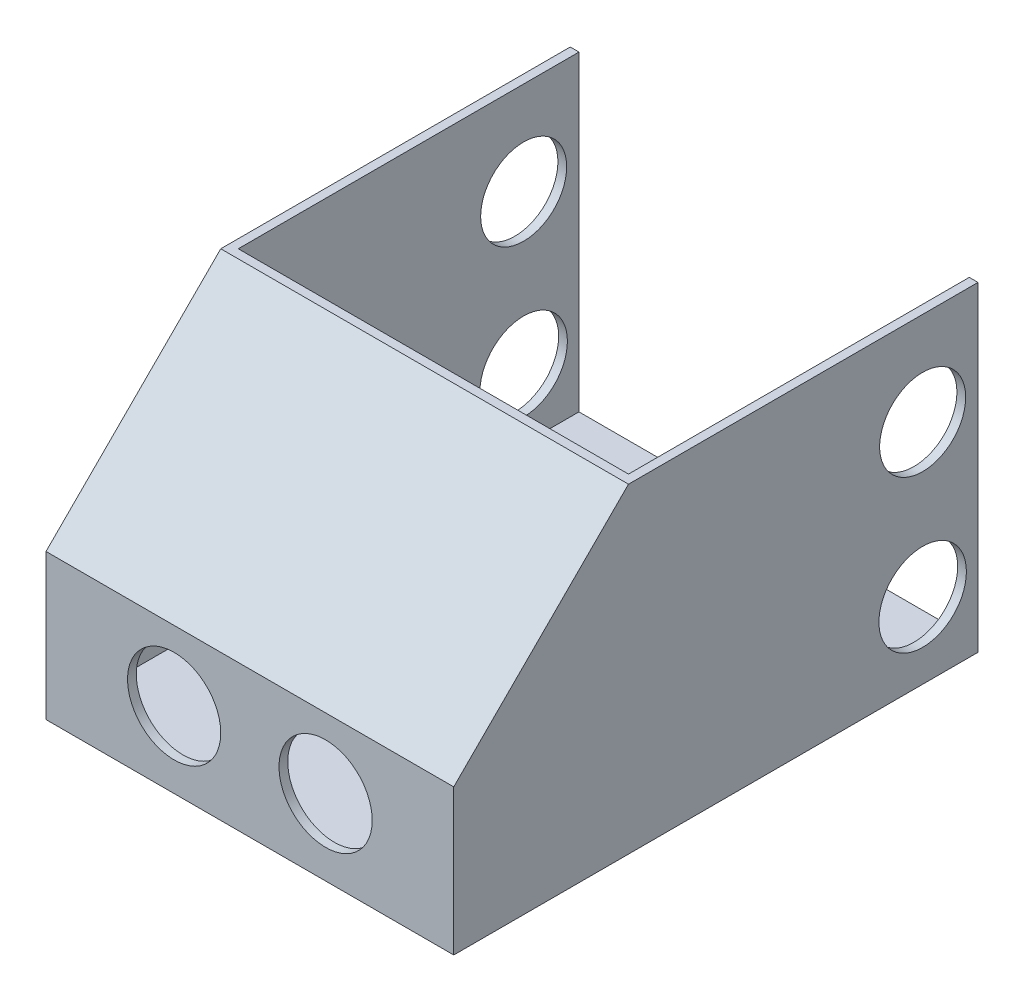
ISO-10303-21;
HEADER;
FILE_DESCRIPTION(('STEP AP214'),'2;1');
FILE_NAME('part.step','',(''),(''),'','','');
FILE_SCHEMA(('AUTOMOTIVE_DESIGN { 1 0 10303 214 1 1 1 1 }'));
ENDSEC;
DATA;
#1=APPLICATION_CONTEXT('core data for automotive mechanical design processes');
#2=APPLICATION_PROTOCOL_DEFINITION('international standard','automotive_design',2000,#1);
#3=PRODUCT_CONTEXT('',#1,'mechanical');
#4=PRODUCT('Part','Part','',(#3));
#5=PRODUCT_RELATED_PRODUCT_CATEGORY('part','',(#4));
#6=PRODUCT_DEFINITION_FORMATION('','',#4);
#7=PRODUCT_DEFINITION_CONTEXT('part definition',#1,'design');
#8=PRODUCT_DEFINITION('design','',#6,#7);
#9=PRODUCT_DEFINITION_SHAPE('','',#8);
#10=(LENGTH_UNIT() NAMED_UNIT(*) SI_UNIT(.MILLI.,.METRE.));
#11=(NAMED_UNIT(*) PLANE_ANGLE_UNIT() SI_UNIT($,.RADIAN.));
#12=(NAMED_UNIT(*) SI_UNIT($,.STERADIAN.) SOLID_ANGLE_UNIT());
#13=UNCERTAINTY_MEASURE_WITH_UNIT(LENGTH_MEASURE(1.E-05),#10,'distance_accuracy_value','');
#14=(GEOMETRIC_REPRESENTATION_CONTEXT(3) GLOBAL_UNCERTAINTY_ASSIGNED_CONTEXT((#13)) GLOBAL_UNIT_ASSIGNED_CONTEXT((#10,
#11,#12)) REPRESENTATION_CONTEXT('',''));
#15=CARTESIAN_POINT('',(0.,0.,0.));
#16=DIRECTION('',(0.,0.,1.));
#17=DIRECTION('',(1.,0.,0.));
#18=AXIS2_PLACEMENT_3D('',#15,#16,#17);
#19=CARTESIAN_POINT('',(35.,55.,-45.));
#20=DIRECTION('',(-1.,0.,0.));
#21=DIRECTION('',(0.,0.,1.));
#22=AXIS2_PLACEMENT_3D('',#19,#20,#21);
#23=PLANE('',#22);
#24=CARTESIAN_POINT('',(35.,39.,-35.5));
#25=DIRECTION('',(1.,0.,0.));
#26=DIRECTION('',(0.,0.,-1.));
#27=AXIS2_PLACEMENT_3D('',#24,#25,#26);
#28=CIRCLE('',#27,7.38265418762645);
#29=CARTESIAN_POINT('',(35.,39.,-42.8826541876264));
#30=VERTEX_POINT('',#29);
#31=EDGE_CURVE('E296',#30,#30,#28,.T.);
#32=ORIENTED_EDGE('',*,*,#31,.F.);
#33=EDGE_LOOP('',(#32));
#34=FACE_BOUND('',#33,.T.);
#35=CARTESIAN_POINT('',(35.,13.,-35.5));
#36=DIRECTION('',(1.,0.,0.));
#37=DIRECTION('',(0.,0.,-1.));
#38=AXIS2_PLACEMENT_3D('',#35,#36,#37);
#39=CIRCLE('',#38,7.509542531742);
#40=CARTESIAN_POINT('',(35.,13.,-43.009542531742));
#41=VERTEX_POINT('',#40);
#42=EDGE_CURVE('E203',#41,#41,#39,.T.);
#43=ORIENTED_EDGE('',*,*,#42,.F.);
#44=EDGE_LOOP('',(#43));
#45=FACE_BOUND('',#44,.T.);
#46=DIRECTION('',(0.,0.,-1.));
#47=VECTOR('',#46,1.);
#48=CARTESIAN_POINT('',(35.,55.,-45.));
#49=LINE('',#48,#47);
#50=CARTESIAN_POINT('',(35.,55.,15.));
#51=VERTEX_POINT('',#50);
#52=CARTESIAN_POINT('',(35.,55.,-45.));
#53=VERTEX_POINT('',#52);
#54=EDGE_CURVE('E151',#51,#53,#49,.T.);
#55=ORIENTED_EDGE('',*,*,#54,.F.);
#56=DIRECTION('',(0.,-0.707106781186549,0.707106781186546));
#57=VECTOR('',#56,1.);
#58=CARTESIAN_POINT('',(35.,55.,15.));
#59=LINE('',#58,#57);
#60=CARTESIAN_POINT('',(35.,24.9999999999999,45.));
#61=VERTEX_POINT('',#60);
#62=EDGE_CURVE('E183',#51,#61,#59,.T.);
#63=ORIENTED_EDGE('',*,*,#62,.T.);
#64=DIRECTION('',(0.,-1.,0.));
#65=VECTOR('',#64,1.);
#66=CARTESIAN_POINT('',(35.,55.,45.));
#67=LINE('',#66,#65);
#68=CARTESIAN_POINT('',(35.,0.,45.));
#69=VERTEX_POINT('',#68);
#70=EDGE_CURVE('E161',#61,#69,#67,.T.);
#71=ORIENTED_EDGE('',*,*,#70,.T.);
#72=DIRECTION('',(0.,0.,-1.));
#73=VECTOR('',#72,1.);
#74=CARTESIAN_POINT('',(35.,0.,-45.));
#75=LINE('',#74,#73);
#76=CARTESIAN_POINT('',(35.,0.,-45.));
#77=VERTEX_POINT('',#76);
#78=EDGE_CURVE('E146',#69,#77,#75,.T.);
#79=ORIENTED_EDGE('',*,*,#78,.T.);
#80=DIRECTION('',(0.,-1.,0.));
#81=VECTOR('',#80,1.);
#82=CARTESIAN_POINT('',(35.,55.,-45.));
#83=LINE('',#82,#81);
#84=EDGE_CURVE('E177',#53,#77,#83,.T.);
#85=ORIENTED_EDGE('',*,*,#84,.F.);
#86=EDGE_LOOP('',(#55,#63,#71,#79,#85));
#87=FACE_BOUND('',#86,.T.);
#88=ADVANCED_FACE('F33',(#34,#45,#87),#23,.F.);
#89=CARTESIAN_POINT('',(-35.,55.,-45.));
#90=DIRECTION('',(0.,0.,1.));
#91=DIRECTION('',(1.,0.,0.));
#92=AXIS2_PLACEMENT_3D('',#89,#90,#91);
#93=PLANE('',#92);
#94=DIRECTION('',(-1.,0.,0.));
#95=VECTOR('',#94,1.);
#96=CARTESIAN_POINT('',(33.5,1.5,-45.));
#97=LINE('',#96,#95);
#98=CARTESIAN_POINT('',(33.5,1.5,-45.));
#99=VERTEX_POINT('',#98);
#100=CARTESIAN_POINT('',(-33.5,1.5,-45.));
#101=VERTEX_POINT('',#100);
#102=EDGE_CURVE('E141',#99,#101,#97,.T.);
#103=ORIENTED_EDGE('',*,*,#102,.F.);
#104=DIRECTION('',(0.,-1.,0.));
#105=VECTOR('',#104,1.);
#106=CARTESIAN_POINT('',(33.5,55.,-45.));
#107=LINE('',#106,#105);
#108=CARTESIAN_POINT('',(33.5,55.,-45.));
#109=VERTEX_POINT('',#108);
#110=EDGE_CURVE('E114',#109,#99,#107,.T.);
#111=ORIENTED_EDGE('',*,*,#110,.F.);
#112=DIRECTION('',(-1.,0.,0.));
#113=VECTOR('',#112,1.);
#114=CARTESIAN_POINT('',(-35.,55.,-45.));
#115=LINE('',#114,#113);
#116=EDGE_CURVE('E155',#53,#109,#115,.T.);
#117=ORIENTED_EDGE('',*,*,#116,.F.);
#118=ORIENTED_EDGE('',*,*,#84,.T.);
#119=DIRECTION('',(-1.,0.,0.));
#120=VECTOR('',#119,1.);
#121=CARTESIAN_POINT('',(-35.,0.,-45.));
#122=LINE('',#121,#120);
#123=CARTESIAN_POINT('',(-35.,0.,-45.));
#124=VERTEX_POINT('',#123);
#125=EDGE_CURVE('E164',#77,#124,#122,.T.);
#126=ORIENTED_EDGE('',*,*,#125,.T.);
#127=DIRECTION('',(0.,-1.,0.));
#128=VECTOR('',#127,1.);
#129=CARTESIAN_POINT('',(-35.,55.,-45.));
#130=LINE('',#129,#128);
#131=CARTESIAN_POINT('',(-35.,55.,-45.));
#132=VERTEX_POINT('',#131);
#133=EDGE_CURVE('E174',#132,#124,#130,.T.);
#134=ORIENTED_EDGE('',*,*,#133,.F.);
#135=CARTESIAN_POINT('',(-33.5,55.,-45.));
#136=VERTEX_POINT('',#135);
#137=EDGE_CURVE('E153',#136,#132,#115,.T.);
#138=ORIENTED_EDGE('',*,*,#137,.F.);
#139=DIRECTION('',(0.,1.,0.));
#140=VECTOR('',#139,1.);
#141=CARTESIAN_POINT('',(-33.5,55.,-45.));
#142=LINE('',#141,#140);
#143=EDGE_CURVE('E139',#101,#136,#142,.T.);
#144=ORIENTED_EDGE('',*,*,#143,.F.);
#145=EDGE_LOOP('',(#103,#111,#117,#118,#126,#134,#138,#144));
#146=FACE_BOUND('',#145,.T.);
#147=ADVANCED_FACE('F248',(#146),#93,.F.);
#148=CARTESIAN_POINT('',(-35.,55.,-45.));
#149=DIRECTION('',(1.,0.,0.));
#150=DIRECTION('',(0.,0.,-1.));
#151=AXIS2_PLACEMENT_3D('',#148,#149,#150);
#152=PLANE('',#151);
#153=CARTESIAN_POINT('',(-35.,39.,-35.5));
#154=DIRECTION('',(1.,0.,0.));
#155=DIRECTION('',(0.,0.,-1.));
#156=AXIS2_PLACEMENT_3D('',#153,#154,#155);
#157=CIRCLE('',#156,7.38265418762645);
#158=CARTESIAN_POINT('',(-35.,39.,-42.8826541876264));
#159=VERTEX_POINT('',#158);
#160=EDGE_CURVE('E294',#159,#159,#157,.T.);
#161=ORIENTED_EDGE('',*,*,#160,.T.);
#162=EDGE_LOOP('',(#161));
#163=FACE_BOUND('',#162,.T.);
#164=CARTESIAN_POINT('',(-35.,13.,-35.5));
#165=DIRECTION('',(1.,0.,0.));
#166=DIRECTION('',(0.,0.,-1.));
#167=AXIS2_PLACEMENT_3D('',#164,#165,#166);
#168=CIRCLE('',#167,7.509542531742);
#169=CARTESIAN_POINT('',(-35.,13.,-43.009542531742));
#170=VERTEX_POINT('',#169);
#171=EDGE_CURVE('E197',#170,#170,#168,.T.);
#172=ORIENTED_EDGE('',*,*,#171,.T.);
#173=EDGE_LOOP('',(#172));
#174=FACE_BOUND('',#173,.T.);
#175=DIRECTION('',(0.,-1.,0.));
#176=VECTOR('',#175,1.);
#177=CARTESIAN_POINT('',(-35.,55.,45.));
#178=LINE('',#177,#176);
#179=CARTESIAN_POINT('',(-35.,24.9999999999999,45.));
#180=VERTEX_POINT('',#179);
#181=CARTESIAN_POINT('',(-35.,0.,45.));
#182=VERTEX_POINT('',#181);
#183=EDGE_CURVE('E172',#180,#182,#178,.T.);
#184=ORIENTED_EDGE('',*,*,#183,.F.);
#185=DIRECTION('',(0.,0.707106781186549,-0.707106781186546));
#186=VECTOR('',#185,1.);
#187=CARTESIAN_POINT('',(-35.,55.,15.));
#188=LINE('',#187,#186);
#189=CARTESIAN_POINT('',(-35.,55.,15.));
#190=VERTEX_POINT('',#189);
#191=EDGE_CURVE('E187',#180,#190,#188,.T.);
#192=ORIENTED_EDGE('',*,*,#191,.T.);
#193=DIRECTION('',(0.,0.,1.));
#194=VECTOR('',#193,1.);
#195=CARTESIAN_POINT('',(-35.,55.,-45.));
#196=LINE('',#195,#194);
#197=EDGE_CURVE('E158',#132,#190,#196,.T.);
#198=ORIENTED_EDGE('',*,*,#197,.F.);
#199=ORIENTED_EDGE('',*,*,#133,.T.);
#200=DIRECTION('',(0.,0.,1.));
#201=VECTOR('',#200,1.);
#202=CARTESIAN_POINT('',(-35.,0.,-45.));
#203=LINE('',#202,#201);
#204=EDGE_CURVE('E166',#124,#182,#203,.T.);
#205=ORIENTED_EDGE('',*,*,#204,.T.);
#206=EDGE_LOOP('',(#184,#192,#198,#199,#205));
#207=FACE_BOUND('',#206,.T.);
#208=ADVANCED_FACE('F222',(#163,#174,#207),#152,.F.);
#209=CARTESIAN_POINT('',(-35.,55.,45.));
#210=DIRECTION('',(0.,0.,-1.));
#211=DIRECTION('',(-1.,0.,0.));
#212=AXIS2_PLACEMENT_3D('',#209,#210,#211);
#213=PLANE('',#212);
#214=CARTESIAN_POINT('',(13.,13.,45.));
#215=DIRECTION('',(0.,0.,1.));
#216=DIRECTION('',(1.,0.,0.));
#217=AXIS2_PLACEMENT_3D('',#214,#215,#216);
#218=CIRCLE('',#217,8.);
#219=CARTESIAN_POINT('',(21.,13.,45.));
#220=VERTEX_POINT('',#219);
#221=EDGE_CURVE('E193',#220,#220,#218,.T.);
#222=ORIENTED_EDGE('',*,*,#221,.F.);
#223=EDGE_LOOP('',(#222));
#224=FACE_BOUND('',#223,.T.);
#225=CARTESIAN_POINT('',(-13.,13.,45.));
#226=DIRECTION('',(0.,0.,1.));
#227=DIRECTION('',(1.,0.,0.));
#228=AXIS2_PLACEMENT_3D('',#225,#226,#227);
#229=CIRCLE('',#228,8.);
#230=CARTESIAN_POINT('',(-4.99999999999999,13.,45.));
#231=VERTEX_POINT('',#230);
#232=EDGE_CURVE('E131',#231,#231,#229,.T.);
#233=ORIENTED_EDGE('',*,*,#232,.F.);
#234=EDGE_LOOP('',(#233));
#235=FACE_BOUND('',#234,.T.);
#236=ORIENTED_EDGE('',*,*,#70,.F.);
#237=DIRECTION('',(-1.,0.,0.));
#238=VECTOR('',#237,1.);
#239=CARTESIAN_POINT('',(-35.,24.9999999999999,45.));
#240=LINE('',#239,#238);
#241=EDGE_CURVE('E185',#61,#180,#240,.T.);
#242=ORIENTED_EDGE('',*,*,#241,.T.);
#243=ORIENTED_EDGE('',*,*,#183,.T.);
#244=DIRECTION('',(1.,0.,0.));
#245=VECTOR('',#244,1.);
#246=CARTESIAN_POINT('',(-35.,0.,45.));
#247=LINE('',#246,#245);
#248=EDGE_CURVE('E154',#182,#69,#247,.T.);
#249=ORIENTED_EDGE('',*,*,#248,.T.);
#250=EDGE_LOOP('',(#236,#242,#243,#249));
#251=FACE_BOUND('',#250,.T.);
#252=ADVANCED_FACE('F218',(#224,#235,#251),#213,.F.);
#253=CARTESIAN_POINT('',(0.,55.,0.));
#254=DIRECTION('',(0.,1.,0.));
#255=DIRECTION('',(0.,0.,1.));
#256=AXIS2_PLACEMENT_3D('',#253,#254,#255);
#257=PLANE('',#256);
#258=DIRECTION('',(0.,0.,-1.));
#259=VECTOR('',#258,1.);
#260=CARTESIAN_POINT('',(33.5,55.,13.5));
#261=LINE('',#260,#259);
#262=CARTESIAN_POINT('',(33.5,55.,13.5));
#263=VERTEX_POINT('',#262);
#264=EDGE_CURVE('E144',#263,#109,#261,.T.);
#265=ORIENTED_EDGE('',*,*,#264,.F.);
#266=DIRECTION('',(1.,0.,0.));
#267=VECTOR('',#266,1.);
#268=CARTESIAN_POINT('',(33.5,55.,13.5));
#269=LINE('',#268,#267);
#270=CARTESIAN_POINT('',(-33.5,55.,13.5));
#271=VERTEX_POINT('',#270);
#272=EDGE_CURVE('E119',#271,#263,#269,.T.);
#273=ORIENTED_EDGE('',*,*,#272,.F.);
#274=DIRECTION('',(0.,0.,-1.));
#275=VECTOR('',#274,1.);
#276=CARTESIAN_POINT('',(-33.5,55.,13.5));
#277=LINE('',#276,#275);
#278=EDGE_CURVE('E147',#271,#136,#277,.T.);
#279=ORIENTED_EDGE('',*,*,#278,.T.);
#280=ORIENTED_EDGE('',*,*,#137,.T.);
#281=ORIENTED_EDGE('',*,*,#197,.T.);
#282=DIRECTION('',(1.,0.,0.));
#283=VECTOR('',#282,1.);
#284=CARTESIAN_POINT('',(35.,55.,15.));
#285=LINE('',#284,#283);
#286=EDGE_CURVE('E180',#190,#51,#285,.T.);
#287=ORIENTED_EDGE('',*,*,#286,.T.);
#288=ORIENTED_EDGE('',*,*,#54,.T.);
#289=ORIENTED_EDGE('',*,*,#116,.T.);
#290=EDGE_LOOP('',(#265,#273,#279,#280,#281,#287,#288,#289));
#291=FACE_BOUND('',#290,.T.);
#292=ADVANCED_FACE('F221',(#291),#257,.T.);
#293=CARTESIAN_POINT('',(0.,0.,0.));
#294=DIRECTION('',(0.,1.,0.));
#295=DIRECTION('',(0.,0.,1.));
#296=AXIS2_PLACEMENT_3D('',#293,#294,#295);
#297=PLANE('',#296);
#298=ORIENTED_EDGE('',*,*,#78,.F.);
#299=ORIENTED_EDGE('',*,*,#248,.F.);
#300=ORIENTED_EDGE('',*,*,#204,.F.);
#301=ORIENTED_EDGE('',*,*,#125,.F.);
#302=EDGE_LOOP('',(#298,#299,#300,#301));
#303=FACE_BOUND('',#302,.T.);
#304=ADVANCED_FACE('F251',(#303),#297,.F.);
#305=CARTESIAN_POINT('',(0.,55.,15.));
#306=DIRECTION('',(0.,0.707106781186546,0.707106781186549));
#307=DIRECTION('',(-1.,0.,0.));
#308=AXIS2_PLACEMENT_3D('',#305,#306,#307);
#309=PLANE('',#308);
#310=ORIENTED_EDGE('',*,*,#191,.F.);
#311=ORIENTED_EDGE('',*,*,#241,.F.);
#312=ORIENTED_EDGE('',*,*,#62,.F.);
#313=ORIENTED_EDGE('',*,*,#286,.F.);
#314=EDGE_LOOP('',(#310,#311,#312,#313));
#315=FACE_BOUND('',#314,.T.);
#316=ADVANCED_FACE('F235',(#315),#309,.T.);
#317=CARTESIAN_POINT('',(33.5,55.,13.5));
#318=DIRECTION('',(1.,0.,0.));
#319=DIRECTION('',(0.,1.,0.));
#320=AXIS2_PLACEMENT_3D('',#317,#318,#319);
#321=PLANE('',#320);
#322=CARTESIAN_POINT('',(33.5,39.,-35.5));
#323=DIRECTION('',(1.,0.,0.));
#324=DIRECTION('',(0.,1.,0.));
#325=AXIS2_PLACEMENT_3D('',#322,#323,#324);
#326=CIRCLE('',#325,7.38265418762645);
#327=CARTESIAN_POINT('',(33.5,46.3826541876264,-35.5));
#328=VERTEX_POINT('',#327);
#329=EDGE_CURVE('E208',#328,#328,#326,.T.);
#330=ORIENTED_EDGE('',*,*,#329,.T.);
#331=EDGE_LOOP('',(#330));
#332=FACE_BOUND('',#331,.T.);
#333=CARTESIAN_POINT('',(33.5,13.,-35.5));
#334=DIRECTION('',(1.,0.,0.));
#335=DIRECTION('',(0.,1.,0.));
#336=AXIS2_PLACEMENT_3D('',#333,#334,#335);
#337=CIRCLE('',#336,7.509542531742);
#338=CARTESIAN_POINT('',(33.5,20.509542531742,-35.5));
#339=VERTEX_POINT('',#338);
#340=EDGE_CURVE('E196',#339,#339,#337,.T.);
#341=ORIENTED_EDGE('',*,*,#340,.T.);
#342=EDGE_LOOP('',(#341));
#343=FACE_BOUND('',#342,.T.);
#344=ORIENTED_EDGE('',*,*,#110,.T.);
#345=DIRECTION('',(0.,0.,-1.));
#346=VECTOR('',#345,1.);
#347=CARTESIAN_POINT('',(33.5,1.5,13.5));
#348=LINE('',#347,#346);
#349=CARTESIAN_POINT('',(33.5,1.5,43.5));
#350=VERTEX_POINT('',#349);
#351=EDGE_CURVE('E110',#350,#99,#348,.T.);
#352=ORIENTED_EDGE('',*,*,#351,.F.);
#353=DIRECTION('',(0.,-1.,0.));
#354=VECTOR('',#353,1.);
#355=CARTESIAN_POINT('',(33.5,1.5,43.5));
#356=LINE('',#355,#354);
#357=CARTESIAN_POINT('',(33.5,25.0000000000005,43.5));
#358=VERTEX_POINT('',#357);
#359=EDGE_CURVE('E57',#358,#350,#356,.T.);
#360=ORIENTED_EDGE('',*,*,#359,.F.);
#361=DIRECTION('',(0.,0.707106781186544,-0.707106781186551));
#362=VECTOR('',#361,1.);
#363=CARTESIAN_POINT('',(33.5,55.0000000000001,13.5000000000001));
#364=LINE('',#363,#362);
#365=EDGE_CURVE('E42',#358,#263,#364,.T.);
#366=ORIENTED_EDGE('',*,*,#365,.T.);
#367=ORIENTED_EDGE('',*,*,#264,.T.);
#368=EDGE_LOOP('',(#344,#352,#360,#366,#367));
#369=FACE_BOUND('',#368,.T.);
#370=ADVANCED_FACE('F112',(#332,#343,#369),#321,.F.);
#371=CARTESIAN_POINT('',(-33.5,55.,13.5));
#372=DIRECTION('',(-1.,0.,0.));
#373=DIRECTION('',(0.,0.,1.));
#374=AXIS2_PLACEMENT_3D('',#371,#372,#373);
#375=PLANE('',#374);
#376=CARTESIAN_POINT('',(-33.5,39.,-35.5));
#377=DIRECTION('',(-1.,0.,0.));
#378=DIRECTION('',(0.,0.,1.));
#379=AXIS2_PLACEMENT_3D('',#376,#377,#378);
#380=CIRCLE('',#379,7.38265418762645);
#381=CARTESIAN_POINT('',(-33.5,39.,-28.1173458123735));
#382=VERTEX_POINT('',#381);
#383=EDGE_CURVE('E37',#382,#382,#380,.T.);
#384=ORIENTED_EDGE('',*,*,#383,.T.);
#385=EDGE_LOOP('',(#384));
#386=FACE_BOUND('',#385,.T.);
#387=CARTESIAN_POINT('',(-33.5,13.,-35.5));
#388=DIRECTION('',(-1.,0.,0.));
#389=DIRECTION('',(0.,0.,1.));
#390=AXIS2_PLACEMENT_3D('',#387,#388,#389);
#391=CIRCLE('',#390,7.509542531742);
#392=CARTESIAN_POINT('',(-33.5,13.,-27.990457468258));
#393=VERTEX_POINT('',#392);
#394=EDGE_CURVE('E194',#393,#393,#391,.T.);
#395=ORIENTED_EDGE('',*,*,#394,.T.);
#396=EDGE_LOOP('',(#395));
#397=FACE_BOUND('',#396,.T.);
#398=ORIENTED_EDGE('',*,*,#143,.T.);
#399=ORIENTED_EDGE('',*,*,#278,.F.);
#400=DIRECTION('',(0.,-0.707106781186544,0.707106781186551));
#401=VECTOR('',#400,1.);
#402=CARTESIAN_POINT('',(-33.5,55.0000000000001,13.5000000000001));
#403=LINE('',#402,#401);
#404=CARTESIAN_POINT('',(-33.5,25.0000000000005,43.5));
#405=VERTEX_POINT('',#404);
#406=EDGE_CURVE('E11',#271,#405,#403,.T.);
#407=ORIENTED_EDGE('',*,*,#406,.T.);
#408=DIRECTION('',(0.,1.,0.));
#409=VECTOR('',#408,1.);
#410=CARTESIAN_POINT('',(-33.5,1.5,43.5));
#411=LINE('',#410,#409);
#412=CARTESIAN_POINT('',(-33.5,1.5,43.5));
#413=VERTEX_POINT('',#412);
#414=EDGE_CURVE('E50',#413,#405,#411,.T.);
#415=ORIENTED_EDGE('',*,*,#414,.F.);
#416=DIRECTION('',(0.,0.,-1.));
#417=VECTOR('',#416,1.);
#418=CARTESIAN_POINT('',(-33.5,1.5,13.5));
#419=LINE('',#418,#417);
#420=EDGE_CURVE('E118',#413,#101,#419,.T.);
#421=ORIENTED_EDGE('',*,*,#420,.T.);
#422=EDGE_LOOP('',(#398,#399,#407,#415,#421));
#423=FACE_BOUND('',#422,.T.);
#424=ADVANCED_FACE('F256',(#386,#397,#423),#375,.F.);
#425=CARTESIAN_POINT('',(33.5,1.5,13.5));
#426=DIRECTION('',(0.,-1.,0.));
#427=DIRECTION('',(0.,0.,-1.));
#428=AXIS2_PLACEMENT_3D('',#425,#426,#427);
#429=PLANE('',#428);
#430=ORIENTED_EDGE('',*,*,#102,.T.);
#431=ORIENTED_EDGE('',*,*,#420,.F.);
#432=DIRECTION('',(-1.,0.,0.));
#433=VECTOR('',#432,1.);
#434=CARTESIAN_POINT('',(33.5,1.5,43.5));
#435=LINE('',#434,#433);
#436=EDGE_CURVE('E121',#350,#413,#435,.T.);
#437=ORIENTED_EDGE('',*,*,#436,.F.);
#438=ORIENTED_EDGE('',*,*,#351,.T.);
#439=EDGE_LOOP('',(#430,#431,#437,#438));
#440=FACE_BOUND('',#439,.T.);
#441=ADVANCED_FACE('F122',(#440),#429,.F.);
#442=CARTESIAN_POINT('',(0.,0.,43.5));
#443=DIRECTION('',(0.,0.,1.));
#444=DIRECTION('',(1.,0.,0.));
#445=AXIS2_PLACEMENT_3D('',#442,#443,#444);
#446=PLANE('',#445);
#447=CARTESIAN_POINT('',(13.,13.,43.5));
#448=DIRECTION('',(0.,0.,1.));
#449=DIRECTION('',(1.,0.,0.));
#450=AXIS2_PLACEMENT_3D('',#447,#448,#449);
#451=CIRCLE('',#450,8.);
#452=CARTESIAN_POINT('',(21.,13.,43.5));
#453=VERTEX_POINT('',#452);
#454=EDGE_CURVE('E191',#453,#453,#451,.T.);
#455=ORIENTED_EDGE('',*,*,#454,.T.);
#456=EDGE_LOOP('',(#455));
#457=FACE_BOUND('',#456,.T.);
#458=CARTESIAN_POINT('',(-13.,13.,43.5));
#459=DIRECTION('',(0.,0.,1.));
#460=DIRECTION('',(1.,0.,0.));
#461=AXIS2_PLACEMENT_3D('',#458,#459,#460);
#462=CIRCLE('',#461,8.);
#463=CARTESIAN_POINT('',(-4.99999999999999,13.,43.5));
#464=VERTEX_POINT('',#463);
#465=EDGE_CURVE('E128',#464,#464,#462,.T.);
#466=ORIENTED_EDGE('',*,*,#465,.T.);
#467=EDGE_LOOP('',(#466));
#468=FACE_BOUND('',#467,.T.);
#469=ORIENTED_EDGE('',*,*,#359,.T.);
#470=ORIENTED_EDGE('',*,*,#436,.T.);
#471=ORIENTED_EDGE('',*,*,#414,.T.);
#472=DIRECTION('',(1.,0.,0.));
#473=VECTOR('',#472,1.);
#474=CARTESIAN_POINT('',(0.,25.0000000000005,43.5));
#475=LINE('',#474,#473);
#476=EDGE_CURVE('E126',#405,#358,#475,.T.);
#477=ORIENTED_EDGE('',*,*,#476,.T.);
#478=EDGE_LOOP('',(#469,#470,#471,#477));
#479=FACE_BOUND('',#478,.T.);
#480=ADVANCED_FACE('F124',(#457,#468,#479),#446,.F.);
#481=CARTESIAN_POINT('',(33.5,24.,44.5000000000006));
#482=DIRECTION('',(0.,-0.707106781186551,-0.707106781186544));
#483=DIRECTION('',(-1.,0.,0.));
#484=AXIS2_PLACEMENT_3D('',#481,#482,#483);
#485=PLANE('',#484);
#486=ORIENTED_EDGE('',*,*,#406,.F.);
#487=ORIENTED_EDGE('',*,*,#272,.T.);
#488=ORIENTED_EDGE('',*,*,#365,.F.);
#489=ORIENTED_EDGE('',*,*,#476,.F.);
#490=EDGE_LOOP('',(#486,#487,#488,#489));
#491=FACE_BOUND('',#490,.T.);
#492=ADVANCED_FACE('F35',(#491),#485,.T.);
#493=CARTESIAN_POINT('',(-13.,13.,-45.));
#494=DIRECTION('',(0.,0.,1.));
#495=DIRECTION('',(1.,0.,0.));
#496=AXIS2_PLACEMENT_3D('',#493,#494,#495);
#497=CYLINDRICAL_SURFACE('',#496,8.);
#498=CARTESIAN_POINT('',(-4.99999999999999,13.,45.));
#499=CARTESIAN_POINT('',(-4.99999999999999,13.,44.984375));
#500=CARTESIAN_POINT('',(-4.99999999999999,13.,44.96875));
#501=CARTESIAN_POINT('',(-4.99999999999999,13.,44.9375));
#502=CARTESIAN_POINT('',(-4.99999999999999,13.,44.921875));
#503=CARTESIAN_POINT('',(-4.99999999999999,13.,44.890625));
#504=CARTESIAN_POINT('',(-4.99999999999999,13.,44.875));
#505=CARTESIAN_POINT('',(-4.99999999999999,13.,44.84375));
#506=CARTESIAN_POINT('',(-4.99999999999999,13.,44.828125));
#507=CARTESIAN_POINT('',(-4.99999999999999,13.,44.796875));
#508=CARTESIAN_POINT('',(-4.99999999999999,13.,44.78125));
#509=CARTESIAN_POINT('',(-4.99999999999999,13.,44.75));
#510=CARTESIAN_POINT('',(-4.99999999999999,13.,44.734375));
#511=CARTESIAN_POINT('',(-4.99999999999999,13.,44.703125));
#512=CARTESIAN_POINT('',(-4.99999999999999,13.,44.6875));
#513=CARTESIAN_POINT('',(-4.99999999999999,13.,44.65625));
#514=CARTESIAN_POINT('',(-4.99999999999999,13.,44.640625));
#515=CARTESIAN_POINT('',(-4.99999999999999,13.,44.609375));
#516=CARTESIAN_POINT('',(-4.99999999999999,13.,44.59375));
#517=CARTESIAN_POINT('',(-4.99999999999999,13.,44.5625));
#518=CARTESIAN_POINT('',(-4.99999999999999,13.,44.546875));
#519=CARTESIAN_POINT('',(-4.99999999999999,13.,44.515625));
#520=CARTESIAN_POINT('',(-4.99999999999999,13.,44.5));
#521=CARTESIAN_POINT('',(-4.99999999999999,13.,44.46875));
#522=CARTESIAN_POINT('',(-4.99999999999999,13.,44.453125));
#523=CARTESIAN_POINT('',(-4.99999999999999,13.,44.421875));
#524=CARTESIAN_POINT('',(-4.99999999999999,13.,44.40625));
#525=CARTESIAN_POINT('',(-4.99999999999999,13.,44.375));
#526=CARTESIAN_POINT('',(-4.99999999999999,13.,44.359375));
#527=CARTESIAN_POINT('',(-4.99999999999999,13.,44.328125));
#528=CARTESIAN_POINT('',(-4.99999999999999,13.,44.3125));
#529=CARTESIAN_POINT('',(-4.99999999999999,13.,44.28125));
#530=CARTESIAN_POINT('',(-4.99999999999999,13.,44.265625));
#531=CARTESIAN_POINT('',(-4.99999999999999,13.,44.234375));
#532=CARTESIAN_POINT('',(-4.99999999999999,13.,44.21875));
#533=CARTESIAN_POINT('',(-4.99999999999999,13.,44.1875));
#534=CARTESIAN_POINT('',(-4.99999999999999,13.,44.171875));
#535=CARTESIAN_POINT('',(-4.99999999999999,13.,44.140625));
#536=CARTESIAN_POINT('',(-4.99999999999999,13.,44.125));
#537=CARTESIAN_POINT('',(-4.99999999999999,13.,44.09375));
#538=CARTESIAN_POINT('',(-4.99999999999999,13.,44.078125));
#539=CARTESIAN_POINT('',(-4.99999999999999,13.,44.046875));
#540=CARTESIAN_POINT('',(-4.99999999999999,13.,44.03125));
#541=CARTESIAN_POINT('',(-4.99999999999999,13.,44.));
#542=CARTESIAN_POINT('',(-4.99999999999999,13.,43.984375));
#543=CARTESIAN_POINT('',(-4.99999999999999,13.,43.953125));
#544=CARTESIAN_POINT('',(-4.99999999999999,13.,43.9375));
#545=CARTESIAN_POINT('',(-4.99999999999999,13.,43.90625));
#546=CARTESIAN_POINT('',(-4.99999999999999,13.,43.890625));
#547=CARTESIAN_POINT('',(-4.99999999999999,13.,43.859375));
#548=CARTESIAN_POINT('',(-4.99999999999999,13.,43.84375));
#549=CARTESIAN_POINT('',(-4.99999999999999,13.,43.8125));
#550=CARTESIAN_POINT('',(-4.99999999999999,13.,43.796875));
#551=CARTESIAN_POINT('',(-4.99999999999999,13.,43.765625));
#552=CARTESIAN_POINT('',(-4.99999999999999,13.,43.75));
#553=CARTESIAN_POINT('',(-4.99999999999999,13.,43.71875));
#554=CARTESIAN_POINT('',(-4.99999999999999,13.,43.703125));
#555=CARTESIAN_POINT('',(-4.99999999999999,13.,43.671875));
#556=CARTESIAN_POINT('',(-4.99999999999999,13.,43.65625));
#557=CARTESIAN_POINT('',(-4.99999999999999,13.,43.625));
#558=CARTESIAN_POINT('',(-4.99999999999999,13.,43.609375));
#559=CARTESIAN_POINT('',(-4.99999999999999,13.,43.578125));
#560=CARTESIAN_POINT('',(-4.99999999999999,13.,43.5625));
#561=CARTESIAN_POINT('',(-4.99999999999999,13.,43.53125));
#562=CARTESIAN_POINT('',(-4.99999999999999,13.,43.515625));
#563=CARTESIAN_POINT('',(-4.99999999999999,13.,43.5));
#564=B_SPLINE_CURVE_WITH_KNOTS('',3,(#498,#499,#500,#501,#502,#503,#504,#505,#506,#507,#508,
#509,#510,#511,#512,#513,#514,#515,#516,#517,#518,#519,#520,#521,#522,#523,#524,#525,#526,#527,
#528,#529,#530,#531,#532,#533,#534,#535,#536,#537,#538,#539,#540,#541,#542,#543,#544,#545,#546,
#547,#548,#549,#550,#551,#552,#553,#554,#555,#556,#557,#558,#559,#560,#561,#562,#563),
.UNSPECIFIED.,.F.,.F.,(4,2,2,2,2,2,2,2,2,2,2,2,2,2,2,2,2,2,2,2,2,2,2,2,2,2,2,2,2,2,2,2,4),(0.,
0.0468750000000018,0.0937500000000036,0.140625000000005,0.187500000000007,0.234374999999995,
0.281249999999997,0.328124999999999,0.375,0.421875000000002,0.468750000000004,0.515625000000006,
0.562499999999994,0.609374999999995,0.656249999999997,0.703124999999999,0.750000000000001,
0.796875000000002,0.843750000000004,0.890625000000006,0.937500000000008,0.984374999999996,
1.03125,1.078125,1.125,1.171875,1.21875,1.26562500000001,1.31249999999999,1.359375,1.40625,
1.453125,1.5),.UNSPECIFIED.);
#565=EDGE_CURVE('BSEAM323',#231,#464,#564,.T.);
#566=ORIENTED_EDGE('',*,*,#232,.T.);
#567=ORIENTED_EDGE('',*,*,#465,.F.);
#568=ORIENTED_EDGE('',*,*,#565,.T.);
#569=ORIENTED_EDGE('',*,*,#565,.F.);
#570=EDGE_LOOP('',(#566,#568,#567,#569));
#571=FACE_BOUND('',#570,.T.);
#572=ADVANCED_FACE('F323',(#571),#497,.F.);
#573=CARTESIAN_POINT('',(13.,13.,-45.));
#574=DIRECTION('',(0.,0.,1.));
#575=DIRECTION('',(1.,0.,0.));
#576=AXIS2_PLACEMENT_3D('',#573,#574,#575);
#577=CYLINDRICAL_SURFACE('',#576,8.);
#578=CARTESIAN_POINT('',(21.,13.,45.));
#579=CARTESIAN_POINT('',(21.,13.,44.984375));
#580=CARTESIAN_POINT('',(21.,13.,44.96875));
#581=CARTESIAN_POINT('',(21.,13.,44.9375));
#582=CARTESIAN_POINT('',(21.,13.,44.921875));
#583=CARTESIAN_POINT('',(21.,13.,44.890625));
#584=CARTESIAN_POINT('',(21.,13.,44.875));
#585=CARTESIAN_POINT('',(21.,13.,44.84375));
#586=CARTESIAN_POINT('',(21.,13.,44.828125));
#587=CARTESIAN_POINT('',(21.,13.,44.796875));
#588=CARTESIAN_POINT('',(21.,13.,44.78125));
#589=CARTESIAN_POINT('',(21.,13.,44.75));
#590=CARTESIAN_POINT('',(21.,13.,44.734375));
#591=CARTESIAN_POINT('',(21.,13.,44.703125));
#592=CARTESIAN_POINT('',(21.,13.,44.6875));
#593=CARTESIAN_POINT('',(21.,13.,44.65625));
#594=CARTESIAN_POINT('',(21.,13.,44.640625));
#595=CARTESIAN_POINT('',(21.,13.,44.609375));
#596=CARTESIAN_POINT('',(21.,13.,44.59375));
#597=CARTESIAN_POINT('',(21.,13.,44.5625));
#598=CARTESIAN_POINT('',(21.,13.,44.546875));
#599=CARTESIAN_POINT('',(21.,13.,44.515625));
#600=CARTESIAN_POINT('',(21.,13.,44.5));
#601=CARTESIAN_POINT('',(21.,13.,44.46875));
#602=CARTESIAN_POINT('',(21.,13.,44.453125));
#603=CARTESIAN_POINT('',(21.,13.,44.421875));
#604=CARTESIAN_POINT('',(21.,13.,44.40625));
#605=CARTESIAN_POINT('',(21.,13.,44.375));
#606=CARTESIAN_POINT('',(21.,13.,44.359375));
#607=CARTESIAN_POINT('',(21.,13.,44.328125));
#608=CARTESIAN_POINT('',(21.,13.,44.3125));
#609=CARTESIAN_POINT('',(21.,13.,44.28125));
#610=CARTESIAN_POINT('',(21.,13.,44.265625));
#611=CARTESIAN_POINT('',(21.,13.,44.234375));
#612=CARTESIAN_POINT('',(21.,13.,44.21875));
#613=CARTESIAN_POINT('',(21.,13.,44.1875));
#614=CARTESIAN_POINT('',(21.,13.,44.171875));
#615=CARTESIAN_POINT('',(21.,13.,44.140625));
#616=CARTESIAN_POINT('',(21.,13.,44.125));
#617=CARTESIAN_POINT('',(21.,13.,44.09375));
#618=CARTESIAN_POINT('',(21.,13.,44.078125));
#619=CARTESIAN_POINT('',(21.,13.,44.046875));
#620=CARTESIAN_POINT('',(21.,13.,44.03125));
#621=CARTESIAN_POINT('',(21.,13.,44.));
#622=CARTESIAN_POINT('',(21.,13.,43.984375));
#623=CARTESIAN_POINT('',(21.,13.,43.953125));
#624=CARTESIAN_POINT('',(21.,13.,43.9375));
#625=CARTESIAN_POINT('',(21.,13.,43.90625));
#626=CARTESIAN_POINT('',(21.,13.,43.890625));
#627=CARTESIAN_POINT('',(21.,13.,43.859375));
#628=CARTESIAN_POINT('',(21.,13.,43.84375));
#629=CARTESIAN_POINT('',(21.,13.,43.8125));
#630=CARTESIAN_POINT('',(21.,13.,43.796875));
#631=CARTESIAN_POINT('',(21.,13.,43.765625));
#632=CARTESIAN_POINT('',(21.,13.,43.75));
#633=CARTESIAN_POINT('',(21.,13.,43.71875));
#634=CARTESIAN_POINT('',(21.,13.,43.703125));
#635=CARTESIAN_POINT('',(21.,13.,43.671875));
#636=CARTESIAN_POINT('',(21.,13.,43.65625));
#637=CARTESIAN_POINT('',(21.,13.,43.625));
#638=CARTESIAN_POINT('',(21.,13.,43.609375));
#639=CARTESIAN_POINT('',(21.,13.,43.578125));
#640=CARTESIAN_POINT('',(21.,13.,43.5625));
#641=CARTESIAN_POINT('',(21.,13.,43.53125));
#642=CARTESIAN_POINT('',(21.,13.,43.515625));
#643=CARTESIAN_POINT('',(21.,13.,43.5));
#644=B_SPLINE_CURVE_WITH_KNOTS('',3,(#578,#579,#580,#581,#582,#583,#584,#585,#586,#587,#588,
#589,#590,#591,#592,#593,#594,#595,#596,#597,#598,#599,#600,#601,#602,#603,#604,#605,#606,#607,
#608,#609,#610,#611,#612,#613,#614,#615,#616,#617,#618,#619,#620,#621,#622,#623,#624,#625,#626,
#627,#628,#629,#630,#631,#632,#633,#634,#635,#636,#637,#638,#639,#640,#641,#642,#643),
.UNSPECIFIED.,.F.,.F.,(4,2,2,2,2,2,2,2,2,2,2,2,2,2,2,2,2,2,2,2,2,2,2,2,2,2,2,2,2,2,2,2,4),(0.,
0.0468750000000018,0.0937500000000036,0.140625000000005,0.187500000000007,0.234374999999995,
0.281249999999997,0.328124999999999,0.375,0.421875000000002,0.468750000000004,0.515625000000006,
0.562499999999994,0.609374999999995,0.656249999999997,0.703124999999999,0.750000000000001,
0.796875000000002,0.843750000000004,0.890625000000006,0.937500000000008,0.984374999999996,
1.03125,1.078125,1.125,1.171875,1.21875,1.26562500000001,1.31249999999999,1.359375,1.40625,
1.453125,1.5),.UNSPECIFIED.);
#645=EDGE_CURVE('BSEAM215',#220,#453,#644,.T.);
#646=ORIENTED_EDGE('',*,*,#221,.T.);
#647=ORIENTED_EDGE('',*,*,#454,.F.);
#648=ORIENTED_EDGE('',*,*,#645,.T.);
#649=ORIENTED_EDGE('',*,*,#645,.F.);
#650=EDGE_LOOP('',(#646,#648,#647,#649));
#651=FACE_BOUND('',#650,.T.);
#652=ADVANCED_FACE('F215',(#651),#577,.F.);
#653=CARTESIAN_POINT('',(-35.,13.,-35.5));
#654=DIRECTION('',(1.,0.,0.));
#655=DIRECTION('',(0.,0.,-1.));
#656=AXIS2_PLACEMENT_3D('',#653,#654,#655);
#657=CYLINDRICAL_SURFACE('',#656,7.509542531742);
#658=ORIENTED_EDGE('',*,*,#171,.F.);
#659=EDGE_LOOP('',(#658));
#660=FACE_BOUND('',#659,.T.);
#661=ORIENTED_EDGE('',*,*,#394,.F.);
#662=EDGE_LOOP('',(#661));
#663=FACE_BOUND('',#662,.T.);
#664=ADVANCED_FACE('F312',(#660,#663),#657,.F.);
#665=ORIENTED_EDGE('',*,*,#42,.T.);
#666=EDGE_LOOP('',(#665));
#667=FACE_BOUND('',#666,.T.);
#668=ORIENTED_EDGE('',*,*,#340,.F.);
#669=EDGE_LOOP('',(#668));
#670=FACE_BOUND('',#669,.T.);
#671=ADVANCED_FACE('F310',(#667,#670),#657,.F.);
#672=CARTESIAN_POINT('',(-35.,39.,-35.5));
#673=DIRECTION('',(1.,0.,0.));
#674=DIRECTION('',(0.,0.,-1.));
#675=AXIS2_PLACEMENT_3D('',#672,#673,#674);
#676=CYLINDRICAL_SURFACE('',#675,7.38265418762645);
#677=ORIENTED_EDGE('',*,*,#160,.F.);
#678=EDGE_LOOP('',(#677));
#679=FACE_BOUND('',#678,.T.);
#680=ORIENTED_EDGE('',*,*,#383,.F.);
#681=EDGE_LOOP('',(#680));
#682=FACE_BOUND('',#681,.T.);
#683=ADVANCED_FACE('F303',(#679,#682),#676,.F.);
#684=ORIENTED_EDGE('',*,*,#31,.T.);
#685=EDGE_LOOP('',(#684));
#686=FACE_BOUND('',#685,.T.);
#687=ORIENTED_EDGE('',*,*,#329,.F.);
#688=EDGE_LOOP('',(#687));
#689=FACE_BOUND('',#688,.T.);
#690=ADVANCED_FACE('F300',(#686,#689),#676,.F.);
#691=CLOSED_SHELL('',(#88,#147,#208,#252,#292,#304,#316,#370,#424,#441,#480,#492,#572,#652,#664,
#671,#683,#690));
#692=MANIFOLD_SOLID_BREP('B2',#691);
#693=ADVANCED_BREP_SHAPE_REPRESENTATION('',(#18,#692),#14);
#694=SHAPE_DEFINITION_REPRESENTATION(#9,#693);
ENDSEC;
END-ISO-10303-21;
